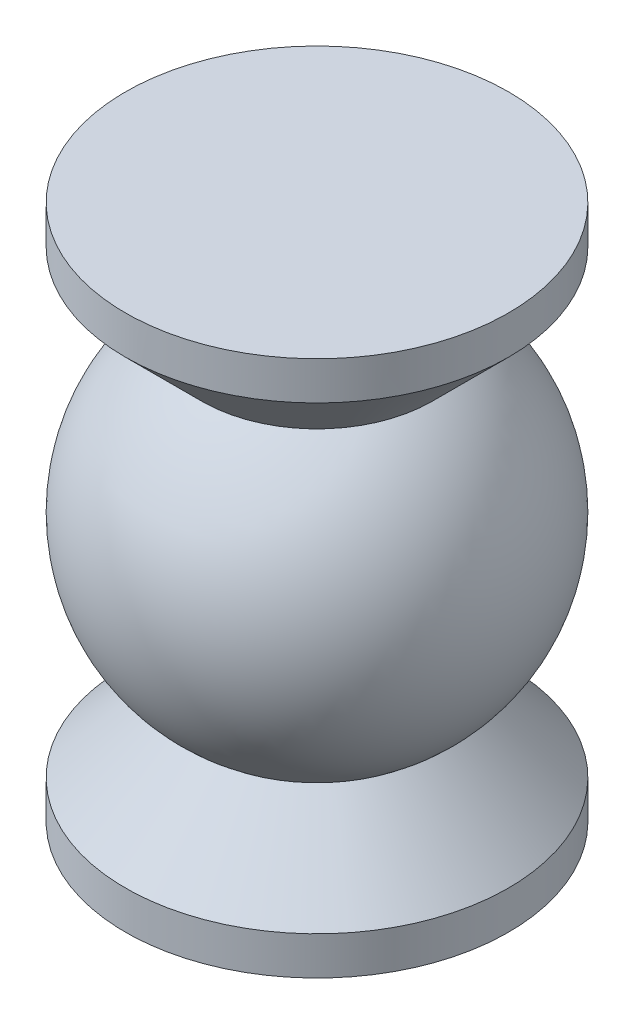
ISO-10303-21;
HEADER;
FILE_DESCRIPTION(('STEP AP214'),'2;1');
FILE_NAME('part.step','',(''),(''),'','','');
FILE_SCHEMA(('AUTOMOTIVE_DESIGN { 1 0 10303 214 1 1 1 1 }'));
ENDSEC;
DATA;
#1=APPLICATION_CONTEXT('core data for automotive mechanical design processes');
#2=APPLICATION_PROTOCOL_DEFINITION('international standard','automotive_design',2000,#1);
#3=PRODUCT_CONTEXT('',#1,'mechanical');
#4=PRODUCT('Part','Part','',(#3));
#5=PRODUCT_RELATED_PRODUCT_CATEGORY('part','',(#4));
#6=PRODUCT_DEFINITION_FORMATION('','',#4);
#7=PRODUCT_DEFINITION_CONTEXT('part definition',#1,'design');
#8=PRODUCT_DEFINITION('design','',#6,#7);
#9=PRODUCT_DEFINITION_SHAPE('','',#8);
#10=(LENGTH_UNIT() NAMED_UNIT(*) SI_UNIT(.MILLI.,.METRE.));
#11=(NAMED_UNIT(*) PLANE_ANGLE_UNIT() SI_UNIT($,.RADIAN.));
#12=(NAMED_UNIT(*) SI_UNIT($,.STERADIAN.) SOLID_ANGLE_UNIT());
#13=UNCERTAINTY_MEASURE_WITH_UNIT(LENGTH_MEASURE(1.E-05),#10,'distance_accuracy_value','');
#14=(GEOMETRIC_REPRESENTATION_CONTEXT(3) GLOBAL_UNCERTAINTY_ASSIGNED_CONTEXT((#13)) GLOBAL_UNIT_ASSIGNED_CONTEXT((#10,
#11,#12)) REPRESENTATION_CONTEXT('',''));
#15=CARTESIAN_POINT('',(0.,0.,0.));
#16=DIRECTION('',(0.,0.,1.));
#17=DIRECTION('',(1.,0.,0.));
#18=AXIS2_PLACEMENT_3D('',#15,#16,#17);
#19=CARTESIAN_POINT('',(0.,0.,0.));
#20=DIRECTION('',(0.,-1.,0.));
#21=DIRECTION('',(0.,0.,-1.));
#22=AXIS2_PLACEMENT_3D('',#19,#20,#21);
#23=PLANE('',#22);
#24=CARTESIAN_POINT('',(0.,0.,0.));
#25=DIRECTION('',(0.,-1.,0.));
#26=DIRECTION('',(0.,0.,-1.));
#27=AXIS2_PLACEMENT_3D('',#24,#25,#26);
#28=CIRCLE('',#27,25.);
#29=CARTESIAN_POINT('',(0.,0.,-25.));
#30=VERTEX_POINT('',#29);
#31=EDGE_CURVE('E10',#30,#30,#28,.T.);
#32=ORIENTED_EDGE('',*,*,#31,.T.);
#33=EDGE_LOOP('',(#32));
#34=FACE_BOUND('',#33,.T.);
#35=ADVANCED_FACE('F37',(#34),#23,.T.);
#36=CARTESIAN_POINT('',(0.,0.,0.));
#37=DIRECTION('',(0.,-1.,0.));
#38=DIRECTION('',(0.,0.,-1.));
#39=AXIS2_PLACEMENT_3D('',#36,#37,#38);
#40=CYLINDRICAL_SURFACE('',#39,25.);
#41=CARTESIAN_POINT('',(0.,5.,0.));
#42=DIRECTION('',(0.,-1.,0.));
#43=DIRECTION('',(0.,0.,-1.));
#44=AXIS2_PLACEMENT_3D('',#41,#42,#43);
#45=CIRCLE('',#44,25.);
#46=CARTESIAN_POINT('',(0.,5.,-25.));
#47=VERTEX_POINT('',#46);
#48=EDGE_CURVE('E44',#47,#47,#45,.T.);
#49=ORIENTED_EDGE('',*,*,#48,.T.);
#50=EDGE_LOOP('',(#49));
#51=FACE_BOUND('',#50,.T.);
#52=ORIENTED_EDGE('',*,*,#31,.F.);
#53=EDGE_LOOP('',(#52));
#54=FACE_BOUND('',#53,.T.);
#55=ADVANCED_FACE('F81',(#51,#54),#40,.T.);
#56=CARTESIAN_POINT('',(0.,5.,0.));
#57=DIRECTION('',(0.,-1.,0.));
#58=DIRECTION('',(0.,0.,-1.));
#59=AXIS2_PLACEMENT_3D('',#56,#57,#58);
#60=CONICAL_SURFACE('',#59,25.,0.785398163397449);
#61=CARTESIAN_POINT('',(0.,15.,0.));
#62=DIRECTION('',(0.,-1.,0.));
#63=DIRECTION('',(0.,0.,-1.));
#64=AXIS2_PLACEMENT_3D('',#61,#62,#63);
#65=CIRCLE('',#64,15.);
#66=CARTESIAN_POINT('',(15.,15.,0.));
#67=VERTEX_POINT('',#66);
#68=EDGE_CURVE('E49',#67,#67,#65,.T.);
#69=ORIENTED_EDGE('',*,*,#68,.T.);
#70=EDGE_LOOP('',(#69));
#71=FACE_BOUND('',#70,.T.);
#72=ORIENTED_EDGE('',*,*,#48,.F.);
#73=EDGE_LOOP('',(#72));
#74=FACE_BOUND('',#73,.T.);
#75=ADVANCED_FACE('F85',(#71,#74),#60,.T.);
#76=CARTESIAN_POINT('',(0.,35.,0.));
#77=DIRECTION('',(0.,-1.,0.));
#78=DIRECTION('',(1.,0.,0.));
#79=AXIS2_PLACEMENT_3D('',#76,#77,#78);
#80=SPHERICAL_SURFACE('',#79,25.);
#81=CARTESIAN_POINT('',(0.,55.,0.));
#82=DIRECTION('',(0.,-1.,0.));
#83=DIRECTION('',(0.,0.,-1.));
#84=AXIS2_PLACEMENT_3D('',#81,#82,#83);
#85=CIRCLE('',#84,15.);
#86=CARTESIAN_POINT('',(15.,55.,0.));
#87=VERTEX_POINT('',#86);
#88=EDGE_CURVE('E54',#87,#87,#85,.T.);
#89=CARTESIAN_POINT('',(15.,55.,0.));
#90=CARTESIAN_POINT('',(15.386383877575,54.7102331585329,0.));
#91=CARTESIAN_POINT('',(15.764349304277,54.4092445387064,0.));
#92=CARTESIAN_POINT('',(16.5022218904126,53.785891059142,0.));
#93=CARTESIAN_POINT('',(16.8621290498462,53.4635261994041,0.));
#94=CARTESIAN_POINT('',(17.5626637359227,52.798487556824,0.));
#95=CARTESIAN_POINT('',(17.9032912625656,52.4558137739817,0.));
#96=CARTESIAN_POINT('',(18.5641263057405,51.751312031891,0.));
#97=CARTESIAN_POINT('',(18.8843338222726,51.3894840726425,0.));
#98=CARTESIAN_POINT('',(19.5032526836538,50.6478878896459,0.));
#99=CARTESIAN_POINT('',(19.8019640285029,50.2681196658977,0.));
#100=CARTESIAN_POINT('',(20.3768877346254,49.4919184892619,0.));
#101=CARTESIAN_POINT('',(20.6531000958988,49.0954855363742,0.));
#102=CARTESIAN_POINT('',(21.1820982609088,48.2872860261715,0.));
#103=CARTESIAN_POINT('',(21.4348840646454,47.8755194688565,0.));
#104=CARTESIAN_POINT('',(21.9161802896365,47.0380354631662,0.));
#105=CARTESIAN_POINT('',(22.1446907108911,46.6123180147909,0.));
#106=CARTESIAN_POINT('',(22.5766688391047,45.748361760207,0.));
#107=CARTESIAN_POINT('',(22.7801365460637,45.3101229539983,0.));
#108=CARTESIAN_POINT('',(23.1613460121235,44.4225955702136,0.));
#109=CARTESIAN_POINT('',(23.3390877712243,43.9733069926376,0.));
#110=CARTESIAN_POINT('',(23.6682484928968,43.065188755281,0.));
#111=CARTESIAN_POINT('',(23.8196674554685,42.6063590955005,0.));
#112=CARTESIAN_POINT('',(24.0956741265362,41.6806994219065,0.));
#113=CARTESIAN_POINT('',(24.2202618350321,41.2138694080932,0.));
#114=CARTESIAN_POINT('',(24.4421876383544,40.2737766192749,0.));
#115=CARTESIAN_POINT('',(24.5395257331807,39.80051384427,0.));
#116=CARTESIAN_POINT('',(24.7066254525011,38.8491447268512,0.));
#117=CARTESIAN_POINT('',(24.7763870769951,38.3710383844373,0.));
#118=CARTESIAN_POINT('',(24.8880995994487,37.411587590441,0.));
#119=CARTESIAN_POINT('',(24.9300504974084,36.9302431388586,0.));
#120=CARTESIAN_POINT('',(24.9860006976841,35.9659324581841,0.));
#121=CARTESIAN_POINT('',(25.,35.482966229092,0.));
#122=CARTESIAN_POINT('',(25.,34.517033770908,0.));
#123=CARTESIAN_POINT('',(24.9860006976841,34.0340675418159,0.));
#124=CARTESIAN_POINT('',(24.9300504974084,33.0697568611415,0.));
#125=CARTESIAN_POINT('',(24.8880995994487,32.588412409559,0.));
#126=CARTESIAN_POINT('',(24.7763870769951,31.6289616155627,0.));
#127=CARTESIAN_POINT('',(24.7066254525011,31.1508552731488,0.));
#128=CARTESIAN_POINT('',(24.5395257331807,30.19948615573,0.));
#129=CARTESIAN_POINT('',(24.4421876383544,29.7262233807251,0.));
#130=CARTESIAN_POINT('',(24.2202618350321,28.7861305919069,0.));
#131=CARTESIAN_POINT('',(24.0956741265362,28.3193005780935,0.));
#132=CARTESIAN_POINT('',(23.8196674554685,27.3936409044996,0.));
#133=CARTESIAN_POINT('',(23.6682484928968,26.934811244719,0.));
#134=CARTESIAN_POINT('',(23.3390877712243,26.0266930073624,0.));
#135=CARTESIAN_POINT('',(23.1613460121235,25.5774044297864,0.));
#136=CARTESIAN_POINT('',(22.7801365460637,24.6898770460017,0.));
#137=CARTESIAN_POINT('',(22.5766688391047,24.251638239793,0.));
#138=CARTESIAN_POINT('',(22.1446907108911,23.3876819852091,0.));
#139=CARTESIAN_POINT('',(21.9161802896365,22.9619645368338,0.));
#140=CARTESIAN_POINT('',(21.4348840646454,22.1244805311435,0.));
#141=CARTESIAN_POINT('',(21.1820982609088,21.7127139738285,0.));
#142=CARTESIAN_POINT('',(20.6531000958988,20.9045144636258,0.));
#143=CARTESIAN_POINT('',(20.3768877346255,20.5080815107381,0.));
#144=CARTESIAN_POINT('',(19.8019640285029,19.7318803341023,0.));
#145=CARTESIAN_POINT('',(19.5032526836538,19.3521121103541,0.));
#146=CARTESIAN_POINT('',(18.8843338222726,18.6105159273575,0.));
#147=CARTESIAN_POINT('',(18.5641263057405,18.248687968109,0.));
#148=CARTESIAN_POINT('',(17.9032912625656,17.5441862260183,0.));
#149=CARTESIAN_POINT('',(17.5626637359227,17.2015124431761,0.));
#150=CARTESIAN_POINT('',(16.8621290498462,16.5364738005959,0.));
#151=CARTESIAN_POINT('',(16.5022218904126,16.214108940858,0.));
#152=CARTESIAN_POINT('',(15.764349304277,15.5907554612936,0.));
#153=CARTESIAN_POINT('',(15.386383877575,15.2897668414672,0.));
#154=CARTESIAN_POINT('',(15.,15.,0.));
#155=B_SPLINE_CURVE_WITH_KNOTS('',3,(#89,#90,#91,#92,#93,#94,#95,#96,#97,#98,#99,#100,#101,#102,
#103,#104,#105,#106,#107,#108,#109,#110,#111,#112,#113,#114,#115,#116,#117,#118,#119,#120,#121,
#122,#123,#124,#125,#126,#127,#128,#129,#130,#131,#132,#133,#134,#135,#136,#137,#138,#139,#140,
#141,#142,#143,#144,#145,#146,#147,#148,#149,#150,#151,#152,#153,#154),.UNSPECIFIED.,.F.,.F.,(4,
2,2,2,2,2,2,2,2,2,2,2,2,2,2,2,2,2,2,2,2,2,2,2,2,2,2,2,2,2,2,2,4),(0.,1.44869600768679,
2.89739201537359,4.34608802306038,5.79478403074718,7.24348003843398,8.69217604612078,
10.1408720538076,11.5895680614944,13.0382640691812,14.486960076868,15.9356560845548,
17.3843520922416,18.8330480999284,20.2817441076152,21.730440115302,23.1791361229888,
24.6278321306755,26.0765281383623,27.5252241460491,28.9739201537359,30.4226161614227,
31.8713121691095,33.3200081767963,34.7687041844831,36.2174001921699,37.6660961998567,
39.1147922075435,40.5634882152303,42.0121842229171,43.4608802306039,44.9095762382907,
46.3582722459775),.UNSPECIFIED.);
#156=EDGE_CURVE('BSEAM89',#87,#67,#155,.T.);
#157=ORIENTED_EDGE('',*,*,#88,.T.);
#158=ORIENTED_EDGE('',*,*,#68,.F.);
#159=ORIENTED_EDGE('',*,*,#156,.T.);
#160=ORIENTED_EDGE('',*,*,#156,.F.);
#161=EDGE_LOOP('',(#157,#159,#158,#160));
#162=FACE_BOUND('',#161,.T.);
#163=ADVANCED_FACE('F89',(#162),#80,.T.);
#164=CARTESIAN_POINT('',(0.,55.,0.));
#165=DIRECTION('',(0.,1.,0.));
#166=DIRECTION('',(0.,0.,1.));
#167=AXIS2_PLACEMENT_3D('',#164,#165,#166);
#168=CONICAL_SURFACE('',#167,15.,0.785398163397449);
#169=CARTESIAN_POINT('',(0.,65.,0.));
#170=DIRECTION('',(0.,-1.,0.));
#171=DIRECTION('',(0.,0.,-1.));
#172=AXIS2_PLACEMENT_3D('',#169,#170,#171);
#173=CIRCLE('',#172,25.);
#174=CARTESIAN_POINT('',(0.,65.,-25.));
#175=VERTEX_POINT('',#174);
#176=EDGE_CURVE('E60',#175,#175,#173,.T.);
#177=ORIENTED_EDGE('',*,*,#176,.T.);
#178=EDGE_LOOP('',(#177));
#179=FACE_BOUND('',#178,.T.);
#180=ORIENTED_EDGE('',*,*,#88,.F.);
#181=EDGE_LOOP('',(#180));
#182=FACE_BOUND('',#181,.T.);
#183=ADVANCED_FACE('F78',(#179,#182),#168,.T.);
#184=CARTESIAN_POINT('',(0.,0.,0.));
#185=DIRECTION('',(0.,-1.,0.));
#186=DIRECTION('',(0.,0.,-1.));
#187=AXIS2_PLACEMENT_3D('',#184,#185,#186);
#188=CYLINDRICAL_SURFACE('',#187,25.);
#189=CARTESIAN_POINT('',(0.,70.,0.));
#190=DIRECTION('',(0.,-1.,0.));
#191=DIRECTION('',(0.,0.,-1.));
#192=AXIS2_PLACEMENT_3D('',#189,#190,#191);
#193=CIRCLE('',#192,25.);
#194=CARTESIAN_POINT('',(0.,70.,-25.));
#195=VERTEX_POINT('',#194);
#196=EDGE_CURVE('E64',#195,#195,#193,.T.);
#197=ORIENTED_EDGE('',*,*,#196,.T.);
#198=EDGE_LOOP('',(#197));
#199=FACE_BOUND('',#198,.T.);
#200=ORIENTED_EDGE('',*,*,#176,.F.);
#201=EDGE_LOOP('',(#200));
#202=FACE_BOUND('',#201,.T.);
#203=ADVANCED_FACE('F69',(#199,#202),#188,.T.);
#204=CARTESIAN_POINT('',(25.,70.,0.));
#205=DIRECTION('',(0.,1.,0.));
#206=DIRECTION('',(0.,0.,1.));
#207=AXIS2_PLACEMENT_3D('',#204,#205,#206);
#208=PLANE('',#207);
#209=ORIENTED_EDGE('',*,*,#196,.F.);
#210=EDGE_LOOP('',(#209));
#211=FACE_BOUND('',#210,.T.);
#212=ADVANCED_FACE('F72',(#211),#208,.T.);
#213=CLOSED_SHELL('',(#35,#55,#75,#163,#183,#203,#212));
#214=MANIFOLD_SOLID_BREP('B2',#213);
#215=ADVANCED_BREP_SHAPE_REPRESENTATION('',(#18,#214),#14);
#216=SHAPE_DEFINITION_REPRESENTATION(#9,#215);
ENDSEC;
END-ISO-10303-21;
